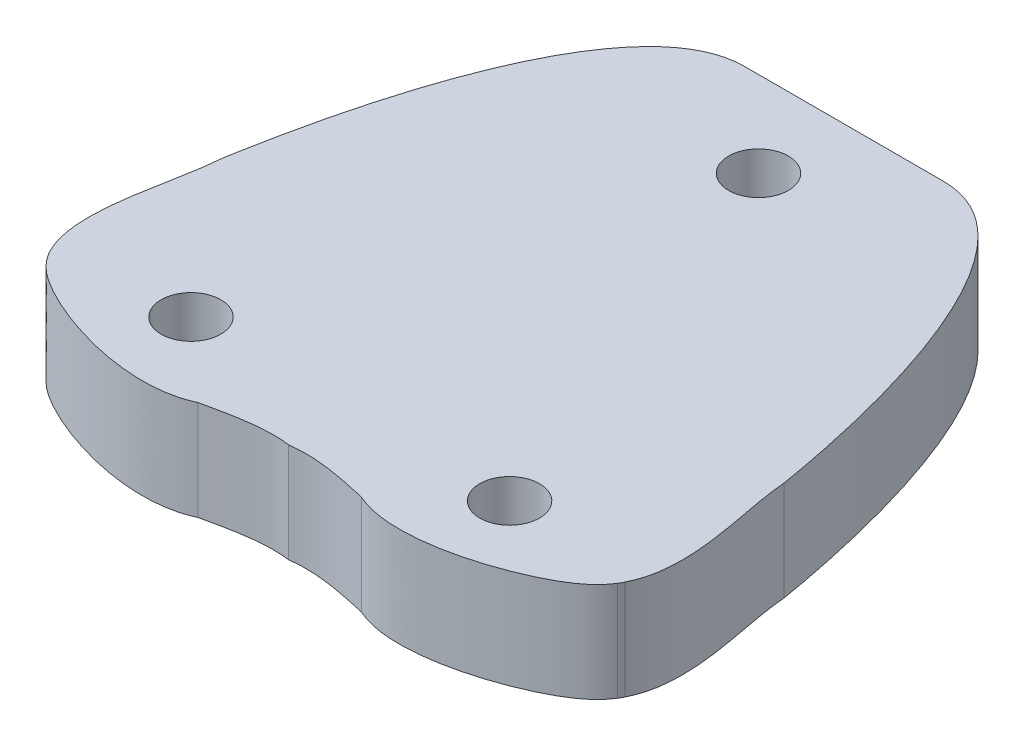
ISO-10303-21;
HEADER;
FILE_DESCRIPTION(('STEP AP214'),'2;1');
FILE_NAME('part.step','',(''),(''),'','','');
FILE_SCHEMA(('AUTOMOTIVE_DESIGN { 1 0 10303 214 1 1 1 1 }'));
ENDSEC;
DATA;
#1=APPLICATION_CONTEXT('core data for automotive mechanical design processes');
#2=APPLICATION_PROTOCOL_DEFINITION('international standard','automotive_design',2000,#1);
#3=PRODUCT_CONTEXT('',#1,'mechanical');
#4=PRODUCT('Part','Part','',(#3));
#5=PRODUCT_RELATED_PRODUCT_CATEGORY('part','',(#4));
#6=PRODUCT_DEFINITION_FORMATION('','',#4);
#7=PRODUCT_DEFINITION_CONTEXT('part definition',#1,'design');
#8=PRODUCT_DEFINITION('design','',#6,#7);
#9=PRODUCT_DEFINITION_SHAPE('','',#8);
#10=(LENGTH_UNIT() NAMED_UNIT(*) SI_UNIT(.MILLI.,.METRE.));
#11=(NAMED_UNIT(*) PLANE_ANGLE_UNIT() SI_UNIT($,.RADIAN.));
#12=(NAMED_UNIT(*) SI_UNIT($,.STERADIAN.) SOLID_ANGLE_UNIT());
#13=UNCERTAINTY_MEASURE_WITH_UNIT(LENGTH_MEASURE(1.E-05),#10,'distance_accuracy_value','');
#14=(GEOMETRIC_REPRESENTATION_CONTEXT(3) GLOBAL_UNCERTAINTY_ASSIGNED_CONTEXT((#13)) GLOBAL_UNIT_ASSIGNED_CONTEXT((#10,
#11,#12)) REPRESENTATION_CONTEXT('',''));
#15=CARTESIAN_POINT('',(0.,0.,0.));
#16=DIRECTION('',(0.,0.,1.));
#17=DIRECTION('',(1.,0.,0.));
#18=AXIS2_PLACEMENT_3D('',#15,#16,#17);
#19=CARTESIAN_POINT('',(-5.,-5.,5.70409598400634));
#20=CARTESIAN_POINT('',(-6.82751305980409,-5.,5.70409598400634));
#21=CARTESIAN_POINT('',(-11.2787693840296,-5.,9.49946043525276));
#22=CARTESIAN_POINT('',(-13.360021762673,-5.,18.6036666833217));
#23=CARTESIAN_POINT('',(-13.9708973376349,-5.,21.999566183213));
#24=B_SPLINE_CURVE_WITH_KNOTS('',3,(#19,#20,#21,#22,#23),.UNSPECIFIED.,.F.,.F.,(4,1,4),(0.,
0.255170628452037,0.749384093863591),.UNSPECIFIED.);
#25=DIRECTION('',(0.,1.,0.));
#26=VECTOR('',#25,1.);
#27=SURFACE_OF_LINEAR_EXTRUSION('',#24,#26);
#28=DIRECTION('',(0.,1.,0.));
#29=VECTOR('',#28,1.);
#30=CARTESIAN_POINT('',(-5.,-5.,5.70409598400634));
#31=LINE('',#30,#29);
#32=CARTESIAN_POINT('',(-5.,0.,5.70409598400634));
#33=VERTEX_POINT('',#32);
#34=CARTESIAN_POINT('',(-5.,5.,5.70409598400634));
#35=VERTEX_POINT('',#34);
#36=EDGE_CURVE('E424',#33,#35,#31,.T.);
#37=ORIENTED_EDGE('',*,*,#36,.F.);
#38=CARTESIAN_POINT('',(-5.,0.,5.70409598400634));
#39=CARTESIAN_POINT('',(-6.82751305980409,0.,5.70409598400634));
#40=CARTESIAN_POINT('',(-11.2787693840296,0.,9.49946043525276));
#41=CARTESIAN_POINT('',(-13.360021762673,0.,18.6036666833217));
#42=CARTESIAN_POINT('',(-13.9708973376349,0.,21.999566183213));
#43=B_SPLINE_CURVE_WITH_KNOTS('',3,(#38,#39,#40,#41,#42),.UNSPECIFIED.,.F.,.F.,(4,1,4),(0.,
0.255170628452037,0.749384093863591),.UNSPECIFIED.);
#44=CARTESIAN_POINT('',(-13.9708973376349,0.,21.999566183213));
#45=VERTEX_POINT('',#44);
#46=EDGE_CURVE('E12',#33,#45,#43,.T.);
#47=ORIENTED_EDGE('',*,*,#46,.T.);
#48=DIRECTION('',(0.,1.,0.));
#49=VECTOR('',#48,1.);
#50=CARTESIAN_POINT('',(-13.9708973376349,-5.,21.999566183213));
#51=LINE('',#50,#49);
#52=CARTESIAN_POINT('',(-13.9708973376349,5.,21.999566183213));
#53=VERTEX_POINT('',#52);
#54=EDGE_CURVE('E161',#45,#53,#51,.T.);
#55=ORIENTED_EDGE('',*,*,#54,.T.);
#56=CARTESIAN_POINT('',(-5.,5.,5.70409598400634));
#57=CARTESIAN_POINT('',(-6.82751305980409,5.,5.70409598400634));
#58=CARTESIAN_POINT('',(-11.2787693840296,5.,9.49946043525276));
#59=CARTESIAN_POINT('',(-13.360021762673,5.,18.6036666833217));
#60=CARTESIAN_POINT('',(-13.9708973376349,5.,21.999566183213));
#61=B_SPLINE_CURVE_WITH_KNOTS('',3,(#56,#57,#58,#59,#60),.UNSPECIFIED.,.F.,.F.,(4,1,4),(0.,
0.255170628452037,0.749384093863591),.UNSPECIFIED.);
#62=EDGE_CURVE('E69',#35,#53,#61,.T.);
#63=ORIENTED_EDGE('',*,*,#62,.F.);
#64=EDGE_LOOP('',(#37,#47,#55,#63));
#65=FACE_BOUND('',#64,.T.);
#66=ADVANCED_FACE('F51',(#65),#27,.T.);
#67=CARTESIAN_POINT('',(0.,-5.,5.70409598400634));
#68=DIRECTION('',(0.,0.,1.));
#69=DIRECTION('',(1.,0.,0.));
#70=AXIS2_PLACEMENT_3D('',#67,#68,#69);
#71=PLANE('',#70);
#72=DIRECTION('',(1.,0.,0.));
#73=VECTOR('',#72,1.);
#74=CARTESIAN_POINT('',(0.,0.,5.70409598400634));
#75=LINE('',#74,#73);
#76=CARTESIAN_POINT('',(5.,0.,5.70409598400634));
#77=VERTEX_POINT('',#76);
#78=EDGE_CURVE('E61',#33,#77,#75,.T.);
#79=ORIENTED_EDGE('',*,*,#78,.F.);
#80=ORIENTED_EDGE('',*,*,#36,.T.);
#81=DIRECTION('',(1.,0.,0.));
#82=VECTOR('',#81,1.);
#83=CARTESIAN_POINT('',(0.,5.,5.70409598400634));
#84=LINE('',#83,#82);
#85=CARTESIAN_POINT('',(5.,5.,5.70409598400634));
#86=VERTEX_POINT('',#85);
#87=EDGE_CURVE('E410',#35,#86,#84,.T.);
#88=ORIENTED_EDGE('',*,*,#87,.T.);
#89=DIRECTION('',(0.,1.,0.));
#90=VECTOR('',#89,1.);
#91=CARTESIAN_POINT('',(5.,-5.,5.70409598400634));
#92=LINE('',#91,#90);
#93=EDGE_CURVE('E427',#77,#86,#92,.T.);
#94=ORIENTED_EDGE('',*,*,#93,.F.);
#95=EDGE_LOOP('',(#79,#80,#88,#94));
#96=FACE_BOUND('',#95,.T.);
#97=ADVANCED_FACE('F391',(#96),#71,.F.);
#98=CARTESIAN_POINT('',(-9.69960803461413,-5.,-1.74482596886035));
#99=DIRECTION('',(-0.984202839731083,0.,-0.177044543167173));
#100=DIRECTION('',(-0.177044543167173,0.,0.984202839731083));
#101=AXIS2_PLACEMENT_3D('',#98,#99,#100);
#102=PLANE('',#101);
#103=ORIENTED_EDGE('',*,*,#54,.F.);
#104=DIRECTION('',(-0.177044543167173,0.,0.984202839731083));
#105=VECTOR('',#104,1.);
#106=CARTESIAN_POINT('',(-9.69960803461413,0.,-1.74482596886035));
#107=LINE('',#106,#105);
#108=CARTESIAN_POINT('',(-14.1100867893013,0.,22.7733299555393));
#109=VERTEX_POINT('',#108);
#110=EDGE_CURVE('E160',#45,#109,#107,.T.);
#111=ORIENTED_EDGE('',*,*,#110,.T.);
#112=DIRECTION('',(0.,1.,0.));
#113=VECTOR('',#112,1.);
#114=CARTESIAN_POINT('',(-14.1100867893012,0.,22.7733299555382));
#115=LINE('',#114,#113);
#116=CARTESIAN_POINT('',(-14.1100867893014,5.,22.7733299555404));
#117=VERTEX_POINT('',#116);
#118=EDGE_CURVE('E164',#117,#109,#115,.F.);
#119=ORIENTED_EDGE('',*,*,#118,.F.);
#120=DIRECTION('',(-0.177044543167173,0.,0.984202839731083));
#121=VECTOR('',#120,1.);
#122=CARTESIAN_POINT('',(-9.69960803461413,5.,-1.74482596886035));
#123=LINE('',#122,#121);
#124=EDGE_CURVE('E419',#53,#117,#123,.T.);
#125=ORIENTED_EDGE('',*,*,#124,.F.);
#126=EDGE_LOOP('',(#103,#111,#119,#125));
#127=FACE_BOUND('',#126,.T.);
#128=ADVANCED_FACE('F398',(#127),#102,.T.);
#129=CARTESIAN_POINT('',(5.,-5.,5.70409598400634));
#130=CARTESIAN_POINT('',(12.1619256138157,-5.,5.70409598400633));
#131=CARTESIAN_POINT('',(14.5347447944711,-5.,25.5521682080075));
#132=CARTESIAN_POINT('',(14.3477011513071,-5.,24.5123895172255));
#133=B_SPLINE_CURVE_WITH_KNOTS('',3,(#129,#130,#131,#132),.UNSPECIFIED.,.F.,.F.,(4,4),(0.,1.),.UNSPECIFIED.);
#134=DIRECTION('',(0.,1.,0.));
#135=VECTOR('',#134,1.);
#136=SURFACE_OF_LINEAR_EXTRUSION('',#133,#135);
#137=CARTESIAN_POINT('',(5.,0.,5.70409598400634));
#138=CARTESIAN_POINT('',(12.1619256138157,0.,5.70409598400633));
#139=CARTESIAN_POINT('',(14.5347447944711,0.,25.5521682080075));
#140=CARTESIAN_POINT('',(14.3477011513071,0.,24.5123895172255));
#141=B_SPLINE_CURVE_WITH_KNOTS('',3,(#137,#138,#139,#140),.UNSPECIFIED.,.F.,.F.,(4,4),(0.,1.),.UNSPECIFIED.);
#142=CARTESIAN_POINT('',(14.1151837437495,0.,22.8353316355471));
#143=VERTEX_POINT('',#142);
#144=EDGE_CURVE('E156',#77,#143,#141,.T.);
#145=ORIENTED_EDGE('',*,*,#144,.F.);
#146=ORIENTED_EDGE('',*,*,#93,.T.);
#147=CARTESIAN_POINT('',(5.,5.,5.70409598400634));
#148=CARTESIAN_POINT('',(12.1619256138157,5.,5.70409598400633));
#149=CARTESIAN_POINT('',(14.5347447944711,5.,25.5521682080075));
#150=CARTESIAN_POINT('',(14.3477011513071,5.,24.5123895172255));
#151=B_SPLINE_CURVE_WITH_KNOTS('',3,(#147,#148,#149,#150),.UNSPECIFIED.,.F.,.F.,(4,4),(0.,1.),.UNSPECIFIED.);
#152=CARTESIAN_POINT('',(14.1151837437507,5.,22.8353316355614));
#153=VERTEX_POINT('',#152);
#154=EDGE_CURVE('E75',#86,#153,#151,.T.);
#155=ORIENTED_EDGE('',*,*,#154,.T.);
#156=DIRECTION('',(0.,1.,0.));
#157=VECTOR('',#156,1.);
#158=CARTESIAN_POINT('',(14.1151837437418,-5.,22.835331635456));
#159=LINE('',#158,#157);
#160=EDGE_CURVE('E148',#153,#143,#159,.F.);
#161=ORIENTED_EDGE('',*,*,#160,.T.);
#162=EDGE_LOOP('',(#145,#146,#155,#161));
#163=FACE_BOUND('',#162,.T.);
#164=ADVANCED_FACE('F163',(#163),#136,.F.);
#165=CARTESIAN_POINT('',(0.,5.,0.));
#166=DIRECTION('',(0.,1.,0.));
#167=DIRECTION('',(0.,0.,1.));
#168=AXIS2_PLACEMENT_3D('',#165,#166,#167);
#169=PLANE('',#168);
#170=CARTESIAN_POINT('',(0.,5.,10.));
#171=DIRECTION('',(0.,1.,0.));
#172=DIRECTION('',(0.,0.,1.));
#173=AXIS2_PLACEMENT_3D('',#170,#171,#172);
#174=CIRCLE('',#173,1.5);
#175=CARTESIAN_POINT('',(0.,5.,11.5));
#176=VERTEX_POINT('',#175);
#177=EDGE_CURVE('E279',#176,#176,#174,.T.);
#178=ORIENTED_EDGE('',*,*,#177,.F.);
#179=EDGE_LOOP('',(#178));
#180=FACE_BOUND('',#179,.T.);
#181=CARTESIAN_POINT('',(-8.,5.,30.5));
#182=DIRECTION('',(0.,1.,0.));
#183=DIRECTION('',(0.,0.,1.));
#184=AXIS2_PLACEMENT_3D('',#181,#182,#183);
#185=CIRCLE('',#184,1.5);
#186=CARTESIAN_POINT('',(-8.,5.,32.));
#187=VERTEX_POINT('',#186);
#188=EDGE_CURVE('E222',#187,#187,#185,.T.);
#189=ORIENTED_EDGE('',*,*,#188,.F.);
#190=EDGE_LOOP('',(#189));
#191=FACE_BOUND('',#190,.T.);
#192=CARTESIAN_POINT('',(8.,5.,30.5));
#193=DIRECTION('',(0.,1.,0.));
#194=DIRECTION('',(0.,0.,-1.));
#195=AXIS2_PLACEMENT_3D('',#192,#193,#194);
#196=CIRCLE('',#195,1.5);
#197=CARTESIAN_POINT('',(8.,5.,29.));
#198=VERTEX_POINT('',#197);
#199=EDGE_CURVE('E364',#198,#198,#196,.T.);
#200=ORIENTED_EDGE('',*,*,#199,.F.);
#201=EDGE_LOOP('',(#200));
#202=FACE_BOUND('',#201,.T.);
#203=ORIENTED_EDGE('',*,*,#154,.F.);
#204=ORIENTED_EDGE('',*,*,#87,.F.);
#205=ORIENTED_EDGE('',*,*,#62,.T.);
#206=ORIENTED_EDGE('',*,*,#124,.T.);
#207=CARTESIAN_POINT('',(-16.4999992526094,5.,0.00496627502048361));
#208=CARTESIAN_POINT('',(-14.7897206769946,5.,16.6018741411366));
#209=CARTESIAN_POINT('',(-14.7798111612056,5.,16.4389731638313));
#210=CARTESIAN_POINT('',(-14.2007326178559,5.,20.551745368853));
#211=CARTESIAN_POINT('',(-13.6355206605634,5.,22.4856023754923));
#212=CARTESIAN_POINT('',(-15.7332672926892,5.,30.4196101932948));
#213=CARTESIAN_POINT('',(-11.3763672698114,5.,34.0736061254484));
#214=CARTESIAN_POINT('',(-1.56418736040587,5.,36.4979809960079));
#215=CARTESIAN_POINT('',(-2.41628191388143,5.,27.9759051430842));
#216=CARTESIAN_POINT('',(-1.88882279632222,5.,23.5));
#217=CARTESIAN_POINT('',(0.,5.,23.5));
#218=B_SPLINE_CURVE_WITH_KNOTS('',3,(#207,#208,#209,#210,#211,#212,#213,#214,#215,#216,#217),
.UNSPECIFIED.,.F.,.F.,(4,1,1,1,1,1,1,1,4),(0.,0.196162037089319,0.243215430463547,
0.470533933742281,0.661030556248264,0.708413552950277,0.91814719544995,0.949927510686168,1.),.UNSPECIFIED.);
#219=CARTESIAN_POINT('',(-14.4276885567641,5.,31.133168853493));
#220=VERTEX_POINT('',#219);
#221=EDGE_CURVE('E177',#117,#220,#218,.T.);
#222=ORIENTED_EDGE('',*,*,#221,.T.);
#223=CARTESIAN_POINT('',(-14.2919667196242,5.,31.3730177430504));
#224=CARTESIAN_POINT('',(-14.349575448779,5.,31.2901661710915));
#225=CARTESIAN_POINT('',(-14.3951464590111,5.,31.2099725405822));
#226=CARTESIAN_POINT('',(-14.4276885567641,5.,31.133168853493));
#227=B_SPLINE_CURVE_WITH_KNOTS('',3,(#223,#224,#225,#226),.UNSPECIFIED.,.F.,.F.,(4,4),(0.,
0.0351059574644979),.UNSPECIFIED.);
#228=CARTESIAN_POINT('',(-14.2919667080857,5.,31.3730177596969));
#229=VERTEX_POINT('',#228);
#230=EDGE_CURVE('E262',#220,#229,#227,.F.);
#231=ORIENTED_EDGE('',*,*,#230,.T.);
#232=CARTESIAN_POINT('',(-4.09931111450431,5.,34.0468380121447));
#233=VERTEX_POINT('',#232);
#234=EDGE_CURVE('E181',#229,#233,#218,.T.);
#235=ORIENTED_EDGE('',*,*,#234,.T.);
#236=CARTESIAN_POINT('',(-14.4276885567641,5.,31.133168853493));
#237=CARTESIAN_POINT('',(-13.9291278076348,5.,32.3098386570732));
#238=CARTESIAN_POINT('',(-7.31625112835586,5.,35.9770016313646));
#239=CARTESIAN_POINT('',(-2.45329734030216,5.,33.2951682755945));
#240=CARTESIAN_POINT('',(0.,5.,33.607159892541));
#241=B_SPLINE_CURVE_WITH_KNOTS('',3,(#236,#237,#238,#239,#240),.UNSPECIFIED.,.F.,.F.,(4,1,4),
(0.,0.537840325637829,1.),.UNSPECIFIED.);
#242=CARTESIAN_POINT('',(0.,5.,33.607159892541));
#243=VERTEX_POINT('',#242);
#244=EDGE_CURVE('E341',#233,#243,#241,.T.);
#245=ORIENTED_EDGE('',*,*,#244,.T.);
#246=CARTESIAN_POINT('',(0.,5.,33.607159892541));
#247=CARTESIAN_POINT('',(2.45329734030216,5.,33.2951682755945));
#248=CARTESIAN_POINT('',(7.31625112835586,5.,35.9770016313646));
#249=CARTESIAN_POINT('',(13.9291278076348,5.,32.3098386570732));
#250=CARTESIAN_POINT('',(14.4276885567641,5.,31.133168853493));
#251=B_SPLINE_CURVE_WITH_KNOTS('',3,(#246,#247,#248,#249,#250),.UNSPECIFIED.,.F.,.F.,(4,1,4),
(0.,0.462159674362171,1.),.UNSPECIFIED.);
#252=CARTESIAN_POINT('',(4.09931111804226,5.,34.0468380137173));
#253=VERTEX_POINT('',#252);
#254=EDGE_CURVE('E348',#243,#253,#251,.T.);
#255=ORIENTED_EDGE('',*,*,#254,.T.);
#256=CARTESIAN_POINT('',(0.,5.,23.5));
#257=CARTESIAN_POINT('',(1.88882279632222,5.,23.5));
#258=CARTESIAN_POINT('',(2.41628191388143,5.,27.9759051430842));
#259=CARTESIAN_POINT('',(1.56418736040587,5.,36.4979809960079));
#260=CARTESIAN_POINT('',(11.3763672698114,5.,34.0736061254484));
#261=CARTESIAN_POINT('',(15.7332672926892,5.,30.4196101932948));
#262=CARTESIAN_POINT('',(13.6355206605634,5.,22.4856023754923));
#263=CARTESIAN_POINT('',(14.2007326178559,5.,20.551745368853));
#264=CARTESIAN_POINT('',(14.7798111612056,5.,16.4389731638313));
#265=CARTESIAN_POINT('',(14.7897206769946,5.,16.6018741411366));
#266=CARTESIAN_POINT('',(16.4999992526094,5.,0.00496627502048361));
#267=B_SPLINE_CURVE_WITH_KNOTS('',3,(#256,#257,#258,#259,#260,#261,#262,#263,#264,#265,#266),
.UNSPECIFIED.,.F.,.F.,(4,1,1,1,1,1,1,1,4),(0.,0.0500724893138318,0.08185280455005,
0.291586447049723,0.338969443751736,0.529466066257719,0.756784569536453,0.803837962910681,1.),.UNSPECIFIED.);
#268=CARTESIAN_POINT('',(14.2919667141307,5.,31.373017750951));
#269=VERTEX_POINT('',#268);
#270=EDGE_CURVE('E172',#253,#269,#267,.T.);
#271=ORIENTED_EDGE('',*,*,#270,.T.);
#272=CARTESIAN_POINT('',(14.4276885567641,5.,31.133168853493));
#273=CARTESIAN_POINT('',(14.3951464579767,5.,31.2099725430235));
#274=CARTESIAN_POINT('',(14.349575445882,5.,31.2901661761896));
#275=CARTESIAN_POINT('',(14.2919667141307,5.,31.373017750951));
#276=B_SPLINE_CURVE_WITH_KNOTS('',3,(#272,#273,#274,#275),.UNSPECIFIED.,.F.,.F.,(4,4),
(0.964894041419617,1.),.UNSPECIFIED.);
#277=CARTESIAN_POINT('',(14.4276885567505,5.,31.1331688535195));
#278=VERTEX_POINT('',#277);
#279=EDGE_CURVE('E274',#269,#278,#276,.F.);
#280=ORIENTED_EDGE('',*,*,#279,.T.);
#281=EDGE_CURVE('E180',#278,#153,#267,.T.);
#282=ORIENTED_EDGE('',*,*,#281,.T.);
#283=EDGE_LOOP('',(#203,#204,#205,#206,#222,#231,#235,#245,#255,#271,#280,#282));
#284=FACE_BOUND('',#283,.T.);
#285=ADVANCED_FACE('F242',(#180,#191,#202,#284),#169,.T.);
#286=CARTESIAN_POINT('',(0.,0.,0.));
#287=DIRECTION('',(0.,1.,0.));
#288=DIRECTION('',(0.,0.,1.));
#289=AXIS2_PLACEMENT_3D('',#286,#287,#288);
#290=PLANE('',#289);
#291=CARTESIAN_POINT('',(0.,0.,10.));
#292=DIRECTION('',(0.,1.,0.));
#293=DIRECTION('',(0.,0.,1.));
#294=AXIS2_PLACEMENT_3D('',#291,#292,#293);
#295=CIRCLE('',#294,1.5);
#296=CARTESIAN_POINT('',(0.,0.,11.5));
#297=VERTEX_POINT('',#296);
#298=EDGE_CURVE('E283',#297,#297,#295,.T.);
#299=ORIENTED_EDGE('',*,*,#298,.T.);
#300=EDGE_LOOP('',(#299));
#301=FACE_BOUND('',#300,.T.);
#302=CARTESIAN_POINT('',(-8.,0.,30.5));
#303=DIRECTION('',(0.,1.,0.));
#304=DIRECTION('',(0.,0.,1.));
#305=AXIS2_PLACEMENT_3D('',#302,#303,#304);
#306=CIRCLE('',#305,1.5);
#307=CARTESIAN_POINT('',(-8.,0.,32.));
#308=VERTEX_POINT('',#307);
#309=EDGE_CURVE('E200',#308,#308,#306,.T.);
#310=ORIENTED_EDGE('',*,*,#309,.T.);
#311=EDGE_LOOP('',(#310));
#312=FACE_BOUND('',#311,.T.);
#313=CARTESIAN_POINT('',(8.,0.,30.5));
#314=DIRECTION('',(0.,1.,0.));
#315=DIRECTION('',(0.,0.,-1.));
#316=AXIS2_PLACEMENT_3D('',#313,#314,#315);
#317=CIRCLE('',#316,1.5);
#318=CARTESIAN_POINT('',(8.,0.,29.));
#319=VERTEX_POINT('',#318);
#320=EDGE_CURVE('E369',#319,#319,#317,.T.);
#321=ORIENTED_EDGE('',*,*,#320,.T.);
#322=EDGE_LOOP('',(#321));
#323=FACE_BOUND('',#322,.T.);
#324=ORIENTED_EDGE('',*,*,#78,.T.);
#325=ORIENTED_EDGE('',*,*,#144,.T.);
#326=CARTESIAN_POINT('',(0.,0.,23.5));
#327=CARTESIAN_POINT('',(1.88882279632222,0.,23.5));
#328=CARTESIAN_POINT('',(2.41628191388143,0.,27.9759051430842));
#329=CARTESIAN_POINT('',(1.56418736040587,0.,36.4979809960079));
#330=CARTESIAN_POINT('',(11.3763672698114,0.,34.0736061254484));
#331=CARTESIAN_POINT('',(15.7332672926892,0.,30.4196101932948));
#332=CARTESIAN_POINT('',(13.6355206605634,0.,22.4856023754923));
#333=CARTESIAN_POINT('',(14.2007326178559,0.,20.551745368853));
#334=CARTESIAN_POINT('',(14.7798111612056,0.,16.4389731638313));
#335=CARTESIAN_POINT('',(14.7897206769946,0.,16.6018741411366));
#336=CARTESIAN_POINT('',(16.4999992526094,0.,0.00496627502048361));
#337=B_SPLINE_CURVE_WITH_KNOTS('',3,(#326,#327,#328,#329,#330,#331,#332,#333,#334,#335,#336),
.UNSPECIFIED.,.F.,.F.,(4,1,1,1,1,1,1,1,4),(0.,0.0500724893138318,0.08185280455005,
0.291586447049723,0.338969443751736,0.529466066257719,0.756784569536453,0.803837962910681,1.),.UNSPECIFIED.);
#338=CARTESIAN_POINT('',(14.4276885567641,0.,31.133168853493));
#339=VERTEX_POINT('',#338);
#340=EDGE_CURVE('E143',#339,#143,#337,.T.);
#341=ORIENTED_EDGE('',*,*,#340,.F.);
#342=CARTESIAN_POINT('',(14.2919667141307,0.,31.373017750951));
#343=CARTESIAN_POINT('',(14.349575445882,0.,31.2901661761896));
#344=CARTESIAN_POINT('',(14.3951464579767,0.,31.2099725430235));
#345=CARTESIAN_POINT('',(14.4276885567641,0.,31.133168853493));
#346=B_SPLINE_CURVE_WITH_KNOTS('',3,(#342,#343,#344,#345),.UNSPECIFIED.,.F.,.F.,(4,4),
(0.964894041419617,1.),.UNSPECIFIED.);
#347=CARTESIAN_POINT('',(14.2919667141307,0.,31.373017750951));
#348=VERTEX_POINT('',#347);
#349=EDGE_CURVE('E152',#348,#339,#346,.T.);
#350=ORIENTED_EDGE('',*,*,#349,.F.);
#351=CARTESIAN_POINT('',(4.09931111450428,0.,34.0468380121447));
#352=VERTEX_POINT('',#351);
#353=EDGE_CURVE('E217',#352,#348,#337,.T.);
#354=ORIENTED_EDGE('',*,*,#353,.F.);
#355=CARTESIAN_POINT('',(0.,0.,33.607159892541));
#356=CARTESIAN_POINT('',(2.45329734030216,0.,33.2951682755945));
#357=CARTESIAN_POINT('',(7.31625112835586,0.,35.9770016313646));
#358=CARTESIAN_POINT('',(13.9291278076348,0.,32.3098386570732));
#359=CARTESIAN_POINT('',(14.4276885567641,0.,31.133168853493));
#360=B_SPLINE_CURVE_WITH_KNOTS('',3,(#355,#356,#357,#358,#359),.UNSPECIFIED.,.F.,.F.,(4,1,4),
(0.,0.462159674362171,1.),.UNSPECIFIED.);
#361=CARTESIAN_POINT('',(0.,0.,33.607159892541));
#362=VERTEX_POINT('',#361);
#363=EDGE_CURVE('E330',#362,#352,#360,.T.);
#364=ORIENTED_EDGE('',*,*,#363,.F.);
#365=CARTESIAN_POINT('',(-14.4276885567641,0.,31.133168853493));
#366=CARTESIAN_POINT('',(-13.9291278076348,0.,32.3098386570732));
#367=CARTESIAN_POINT('',(-7.31625112835586,0.,35.9770016313646));
#368=CARTESIAN_POINT('',(-2.45329734030216,0.,33.2951682755945));
#369=CARTESIAN_POINT('',(0.,0.,33.607159892541));
#370=B_SPLINE_CURVE_WITH_KNOTS('',3,(#365,#366,#367,#368,#369),.UNSPECIFIED.,.F.,.F.,(4,1,4),
(0.,0.537840325637829,1.),.UNSPECIFIED.);
#371=CARTESIAN_POINT('',(-4.09931111450431,0.,34.0468380121447));
#372=VERTEX_POINT('',#371);
#373=EDGE_CURVE('E336',#372,#362,#370,.T.);
#374=ORIENTED_EDGE('',*,*,#373,.F.);
#375=CARTESIAN_POINT('',(-16.4999992526094,0.,0.00496627502048361));
#376=CARTESIAN_POINT('',(-14.7897206769946,0.,16.6018741411366));
#377=CARTESIAN_POINT('',(-14.7798111612056,0.,16.4389731638313));
#378=CARTESIAN_POINT('',(-14.2007326178559,0.,20.551745368853));
#379=CARTESIAN_POINT('',(-13.6355206605634,0.,22.4856023754923));
#380=CARTESIAN_POINT('',(-15.7332672926892,0.,30.4196101932948));
#381=CARTESIAN_POINT('',(-11.3763672698114,0.,34.0736061254484));
#382=CARTESIAN_POINT('',(-1.56418736040587,0.,36.4979809960079));
#383=CARTESIAN_POINT('',(-2.41628191388143,0.,27.9759051430842));
#384=CARTESIAN_POINT('',(-1.88882279632222,0.,23.5));
#385=CARTESIAN_POINT('',(0.,0.,23.5));
#386=B_SPLINE_CURVE_WITH_KNOTS('',3,(#375,#376,#377,#378,#379,#380,#381,#382,#383,#384,#385),
.UNSPECIFIED.,.F.,.F.,(4,1,1,1,1,1,1,1,4),(0.,0.196162037089319,0.243215430463547,
0.470533933742281,0.661030556248264,0.708413552950277,0.91814719544995,0.949927510686168,1.),.UNSPECIFIED.);
#387=CARTESIAN_POINT('',(-14.2919667196242,0.,31.3730177430504));
#388=VERTEX_POINT('',#387);
#389=EDGE_CURVE('E211',#388,#372,#386,.T.);
#390=ORIENTED_EDGE('',*,*,#389,.F.);
#391=CARTESIAN_POINT('',(-14.4276885567641,0.,31.133168853493));
#392=CARTESIAN_POINT('',(-14.3951464590111,0.,31.2099725405822));
#393=CARTESIAN_POINT('',(-14.349575448779,0.,31.2901661710915));
#394=CARTESIAN_POINT('',(-14.2919667196242,0.,31.3730177430504));
#395=B_SPLINE_CURVE_WITH_KNOTS('',3,(#391,#392,#393,#394),.UNSPECIFIED.,.F.,.F.,(4,4),(0.,
0.0351059574644979),.UNSPECIFIED.);
#396=CARTESIAN_POINT('',(-14.4276885567641,0.,31.133168853493));
#397=VERTEX_POINT('',#396);
#398=EDGE_CURVE('E207',#397,#388,#395,.T.);
#399=ORIENTED_EDGE('',*,*,#398,.F.);
#400=EDGE_CURVE('E153',#109,#397,#386,.T.);
#401=ORIENTED_EDGE('',*,*,#400,.F.);
#402=ORIENTED_EDGE('',*,*,#110,.F.);
#403=ORIENTED_EDGE('',*,*,#46,.F.);
#404=EDGE_LOOP('',(#324,#325,#341,#350,#354,#364,#374,#390,#399,#401,#402,#403));
#405=FACE_BOUND('',#404,.T.);
#406=ADVANCED_FACE('F53',(#301,#312,#323,#405),#290,.F.);
#407=DIRECTION('',(0.,1.,0.));
#408=VECTOR('',#407,1.);
#409=SURFACE_OF_LINEAR_EXTRUSION('',#337,#408);
#410=ORIENTED_EDGE('',*,*,#160,.F.);
#411=ORIENTED_EDGE('',*,*,#281,.F.);
#412=DIRECTION('',(0.,1.,0.));
#413=VECTOR('',#412,1.);
#414=CARTESIAN_POINT('',(14.4276885567641,0.,31.133168853493));
#415=LINE('',#414,#413);
#416=EDGE_CURVE('E149',#339,#278,#415,.T.);
#417=ORIENTED_EDGE('',*,*,#416,.F.);
#418=ORIENTED_EDGE('',*,*,#340,.T.);
#419=EDGE_LOOP('',(#410,#411,#417,#418));
#420=FACE_BOUND('',#419,.T.);
#421=ADVANCED_FACE('F145',(#420),#409,.T.);
#422=DIRECTION('',(0.,1.,0.));
#423=VECTOR('',#422,1.);
#424=SURFACE_OF_LINEAR_EXTRUSION('',#386,#423);
#425=DIRECTION('',(0.,1.,0.));
#426=VECTOR('',#425,1.);
#427=CARTESIAN_POINT('',(-4.09931111487533,0.,34.0468380122236));
#428=LINE('',#427,#426);
#429=EDGE_CURVE('E168',#233,#372,#428,.F.);
#430=ORIENTED_EDGE('',*,*,#429,.F.);
#431=ORIENTED_EDGE('',*,*,#234,.F.);
#432=DIRECTION('',(0.,1.,0.));
#433=VECTOR('',#432,1.);
#434=CARTESIAN_POINT('',(-14.2919667083975,0.,31.3730177591964));
#435=LINE('',#434,#433);
#436=EDGE_CURVE('E165',#388,#229,#435,.T.);
#437=ORIENTED_EDGE('',*,*,#436,.F.);
#438=ORIENTED_EDGE('',*,*,#389,.T.);
#439=EDGE_LOOP('',(#430,#431,#437,#438));
#440=FACE_BOUND('',#439,.T.);
#441=ADVANCED_FACE('F237',(#440),#424,.T.);
#442=DIRECTION('',(0.,1.,0.));
#443=VECTOR('',#442,1.);
#444=CARTESIAN_POINT('',(14.2919667083982,0.,31.3730177591953));
#445=LINE('',#444,#443);
#446=EDGE_CURVE('E275',#269,#348,#445,.F.);
#447=ORIENTED_EDGE('',*,*,#446,.F.);
#448=ORIENTED_EDGE('',*,*,#270,.F.);
#449=DIRECTION('',(0.,1.,0.));
#450=VECTOR('',#449,1.);
#451=CARTESIAN_POINT('',(4.09931111487532,0.,34.0468380122236));
#452=LINE('',#451,#450);
#453=EDGE_CURVE('E278',#352,#253,#452,.T.);
#454=ORIENTED_EDGE('',*,*,#453,.F.);
#455=ORIENTED_EDGE('',*,*,#353,.T.);
#456=EDGE_LOOP('',(#447,#448,#454,#455));
#457=FACE_BOUND('',#456,.T.);
#458=ADVANCED_FACE('F240',(#457),#409,.T.);
#459=CARTESIAN_POINT('',(0.,5.,10.));
#460=DIRECTION('',(0.,-1.,0.));
#461=DIRECTION('',(0.,0.,-1.));
#462=AXIS2_PLACEMENT_3D('',#459,#460,#461);
#463=CYLINDRICAL_SURFACE('',#462,1.5);
#464=ORIENTED_EDGE('',*,*,#177,.T.);
#465=EDGE_LOOP('',(#464));
#466=FACE_BOUND('',#465,.T.);
#467=ORIENTED_EDGE('',*,*,#298,.F.);
#468=EDGE_LOOP('',(#467));
#469=FACE_BOUND('',#468,.T.);
#470=ADVANCED_FACE('F235',(#466,#469),#463,.F.);
#471=ORIENTED_EDGE('',*,*,#221,.F.);
#472=ORIENTED_EDGE('',*,*,#118,.T.);
#473=ORIENTED_EDGE('',*,*,#400,.T.);
#474=DIRECTION('',(0.,1.,0.));
#475=VECTOR('',#474,1.);
#476=CARTESIAN_POINT('',(-14.4276885567641,0.,31.133168853493));
#477=LINE('',#476,#475);
#478=EDGE_CURVE('E309',#397,#220,#477,.T.);
#479=ORIENTED_EDGE('',*,*,#478,.T.);
#480=EDGE_LOOP('',(#471,#472,#473,#479));
#481=FACE_BOUND('',#480,.T.);
#482=ADVANCED_FACE('F230',(#481),#424,.T.);
#483=CARTESIAN_POINT('',(-8.,0.,30.5));
#484=DIRECTION('',(0.,1.,0.));
#485=DIRECTION('',(0.,0.,1.));
#486=AXIS2_PLACEMENT_3D('',#483,#484,#485);
#487=CYLINDRICAL_SURFACE('',#486,1.5);
#488=ORIENTED_EDGE('',*,*,#309,.F.);
#489=EDGE_LOOP('',(#488));
#490=FACE_BOUND('',#489,.T.);
#491=ORIENTED_EDGE('',*,*,#188,.T.);
#492=EDGE_LOOP('',(#491));
#493=FACE_BOUND('',#492,.T.);
#494=ADVANCED_FACE('F234',(#490,#493),#487,.F.);
#495=CARTESIAN_POINT('',(8.,0.,30.5));
#496=DIRECTION('',(0.,1.,0.));
#497=DIRECTION('',(0.,0.,1.));
#498=AXIS2_PLACEMENT_3D('',#495,#496,#497);
#499=CYLINDRICAL_SURFACE('',#498,1.5);
#500=ORIENTED_EDGE('',*,*,#320,.F.);
#501=EDGE_LOOP('',(#500));
#502=FACE_BOUND('',#501,.T.);
#503=ORIENTED_EDGE('',*,*,#199,.T.);
#504=EDGE_LOOP('',(#503));
#505=FACE_BOUND('',#504,.T.);
#506=ADVANCED_FACE('F322',(#502,#505),#499,.F.);
#507=DIRECTION('',(0.,1.,0.));
#508=VECTOR('',#507,1.);
#509=SURFACE_OF_LINEAR_EXTRUSION('',#360,#508);
#510=ORIENTED_EDGE('',*,*,#279,.F.);
#511=ORIENTED_EDGE('',*,*,#446,.T.);
#512=ORIENTED_EDGE('',*,*,#349,.T.);
#513=ORIENTED_EDGE('',*,*,#416,.T.);
#514=EDGE_LOOP('',(#510,#511,#512,#513));
#515=FACE_BOUND('',#514,.T.);
#516=ADVANCED_FACE('F294',(#515),#509,.T.);
#517=ORIENTED_EDGE('',*,*,#363,.T.);
#518=ORIENTED_EDGE('',*,*,#453,.T.);
#519=ORIENTED_EDGE('',*,*,#254,.F.);
#520=DIRECTION('',(0.,1.,0.));
#521=VECTOR('',#520,1.);
#522=CARTESIAN_POINT('',(0.,0.,33.607159892541));
#523=LINE('',#522,#521);
#524=EDGE_CURVE('E335',#362,#243,#523,.T.);
#525=ORIENTED_EDGE('',*,*,#524,.F.);
#526=EDGE_LOOP('',(#517,#518,#519,#525));
#527=FACE_BOUND('',#526,.T.);
#528=ADVANCED_FACE('F321',(#527),#509,.T.);
#529=DIRECTION('',(0.,1.,0.));
#530=VECTOR('',#529,1.);
#531=SURFACE_OF_LINEAR_EXTRUSION('',#370,#530);
#532=ORIENTED_EDGE('',*,*,#244,.F.);
#533=ORIENTED_EDGE('',*,*,#429,.T.);
#534=ORIENTED_EDGE('',*,*,#373,.T.);
#535=ORIENTED_EDGE('',*,*,#524,.T.);
#536=EDGE_LOOP('',(#532,#533,#534,#535));
#537=FACE_BOUND('',#536,.T.);
#538=ADVANCED_FACE('F325',(#537),#531,.T.);
#539=ORIENTED_EDGE('',*,*,#398,.T.);
#540=ORIENTED_EDGE('',*,*,#436,.T.);
#541=ORIENTED_EDGE('',*,*,#230,.F.);
#542=ORIENTED_EDGE('',*,*,#478,.F.);
#543=EDGE_LOOP('',(#539,#540,#541,#542));
#544=FACE_BOUND('',#543,.T.);
#545=ADVANCED_FACE('F454',(#544),#531,.T.);
#546=CLOSED_SHELL('',(#66,#97,#128,#164,#285,#406,#421,#441,#458,#470,#482,#494,#506,#516,#528,
#538,#545));
#547=MANIFOLD_SOLID_BREP('B2',#546);
#548=ADVANCED_BREP_SHAPE_REPRESENTATION('',(#18,#547),#14);
#549=SHAPE_DEFINITION_REPRESENTATION(#9,#548);
ENDSEC;
END-ISO-10303-21;
